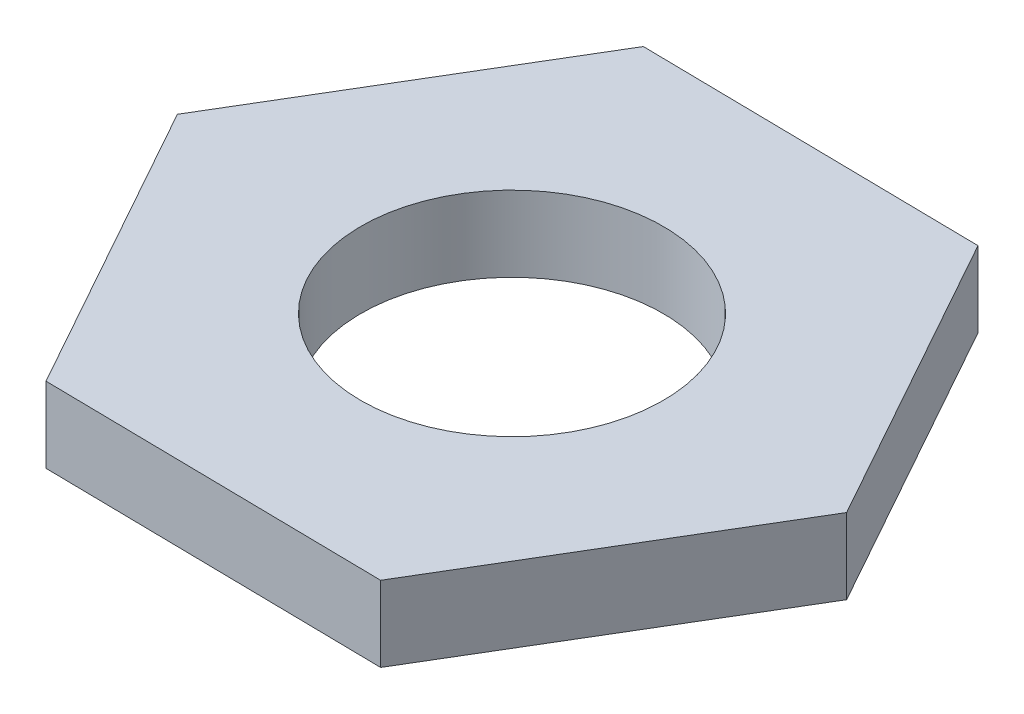
ISO-10303-21;
HEADER;
FILE_DESCRIPTION(('STEP AP214'),'2;1');
FILE_NAME('part.step','',(''),(''),'','','');
FILE_SCHEMA(('AUTOMOTIVE_DESIGN { 1 0 10303 214 1 1 1 1 }'));
ENDSEC;
DATA;
#1=APPLICATION_CONTEXT('core data for automotive mechanical design processes');
#2=APPLICATION_PROTOCOL_DEFINITION('international standard','automotive_design',2000,#1);
#3=PRODUCT_CONTEXT('',#1,'mechanical');
#4=PRODUCT('Part','Part','',(#3));
#5=PRODUCT_RELATED_PRODUCT_CATEGORY('part','',(#4));
#6=PRODUCT_DEFINITION_FORMATION('','',#4);
#7=PRODUCT_DEFINITION_CONTEXT('part definition',#1,'design');
#8=PRODUCT_DEFINITION('design','',#6,#7);
#9=PRODUCT_DEFINITION_SHAPE('','',#8);
#10=(LENGTH_UNIT() NAMED_UNIT(*) SI_UNIT(.MILLI.,.METRE.));
#11=(NAMED_UNIT(*) PLANE_ANGLE_UNIT() SI_UNIT($,.RADIAN.));
#12=(NAMED_UNIT(*) SI_UNIT($,.STERADIAN.) SOLID_ANGLE_UNIT());
#13=UNCERTAINTY_MEASURE_WITH_UNIT(LENGTH_MEASURE(1.E-05),#10,'distance_accuracy_value','');
#14=(GEOMETRIC_REPRESENTATION_CONTEXT(3) GLOBAL_UNCERTAINTY_ASSIGNED_CONTEXT((#13)) GLOBAL_UNIT_ASSIGNED_CONTEXT((#10,
#11,#12)) REPRESENTATION_CONTEXT('',''));
#15=CARTESIAN_POINT('',(0.,0.,0.));
#16=DIRECTION('',(0.,0.,1.));
#17=DIRECTION('',(1.,0.,0.));
#18=AXIS2_PLACEMENT_3D('',#15,#16,#17);
#19=CARTESIAN_POINT('',(0.,1.,0.));
#20=DIRECTION('',(0.,1.,0.));
#21=DIRECTION('',(0.,0.,1.));
#22=AXIS2_PLACEMENT_3D('',#19,#20,#21);
#23=PLANE('',#22);
#24=DIRECTION('',(0.513027599936732,0.,-0.858372111443025));
#25=VECTOR('',#24,1.);
#26=CARTESIAN_POINT('',(2.19086214498621,1.,3.93066445549177));
#27=LINE('',#26,#25);
#28=CARTESIAN_POINT('',(2.19086214498621,1.,3.93066445549177));
#29=VERTEX_POINT('',#28);
#30=CARTESIAN_POINT('',(4.4994863447015,1.,0.0679899539981618));
#31=VERTEX_POINT('',#30);
#32=EDGE_CURVE('E150',#29,#31,#27,.T.);
#33=ORIENTED_EDGE('',*,*,#32,.T.);
#34=DIRECTION('',(-0.48685825444138,0.,-0.873480990109282));
#35=VECTOR('',#34,1.);
#36=CARTESIAN_POINT('',(4.4994863447015,1.,0.0679899539981618));
#37=LINE('',#36,#35);
#38=CARTESIAN_POINT('',(2.30862419971529,1.,-3.86267450149361));
#39=VERTEX_POINT('',#38);
#40=EDGE_CURVE('E98',#31,#39,#37,.T.);
#41=ORIENTED_EDGE('',*,*,#40,.T.);
#42=DIRECTION('',(-0.999885854378113,0.,-0.0151088786662587));
#43=VECTOR('',#42,1.);
#44=CARTESIAN_POINT('',(2.30862419971529,1.,-3.86267450149361));
#45=LINE('',#44,#43);
#46=CARTESIAN_POINT('',(-2.19086214498621,1.,-3.93066445549177));
#47=VERTEX_POINT('',#46);
#48=EDGE_CURVE('E111',#39,#47,#45,.T.);
#49=ORIENTED_EDGE('',*,*,#48,.T.);
#50=DIRECTION('',(-0.513027599936733,0.,0.858372111443024));
#51=VECTOR('',#50,1.);
#52=CARTESIAN_POINT('',(-2.19086214498621,1.,-3.93066445549177));
#53=LINE('',#52,#51);
#54=CARTESIAN_POINT('',(-4.4994863447015,1.,-0.0679899539981613));
#55=VERTEX_POINT('',#54);
#56=EDGE_CURVE('E105',#47,#55,#53,.T.);
#57=ORIENTED_EDGE('',*,*,#56,.T.);
#58=DIRECTION('',(0.48685825444138,0.,0.873480990109283));
#59=VECTOR('',#58,1.);
#60=CARTESIAN_POINT('',(-4.4994863447015,1.,-0.0679899539981613));
#61=LINE('',#60,#59);
#62=CARTESIAN_POINT('',(-2.3086241997153,1.,3.86267450149361));
#63=VERTEX_POINT('',#62);
#64=EDGE_CURVE('E109',#55,#63,#61,.T.);
#65=ORIENTED_EDGE('',*,*,#64,.T.);
#66=DIRECTION('',(0.999885854378113,0.,0.0151088786662585));
#67=VECTOR('',#66,1.);
#68=CARTESIAN_POINT('',(-2.3086241997153,1.,3.86267450149361));
#69=LINE('',#68,#67);
#70=EDGE_CURVE('E61',#63,#29,#69,.T.);
#71=ORIENTED_EDGE('',*,*,#70,.T.);
#72=EDGE_LOOP('',(#33,#41,#49,#57,#65,#71));
#73=FACE_BOUND('',#72,.T.);
#74=CARTESIAN_POINT('',(0.,1.,0.));
#75=DIRECTION('',(0.,1.,0.));
#76=DIRECTION('',(0.,0.,1.));
#77=AXIS2_PLACEMENT_3D('',#74,#75,#76);
#78=CIRCLE('',#77,2.);
#79=CARTESIAN_POINT('',(0.,1.,2.));
#80=VERTEX_POINT('',#79);
#81=EDGE_CURVE('E138',#80,#80,#78,.T.);
#82=ORIENTED_EDGE('',*,*,#81,.F.);
#83=EDGE_LOOP('',(#82));
#84=FACE_BOUND('',#83,.T.);
#85=ADVANCED_FACE('F43',(#73,#84),#23,.T.);
#86=CARTESIAN_POINT('',(0.,0.,0.));
#87=DIRECTION('',(0.,1.,0.));
#88=DIRECTION('',(0.,0.,1.));
#89=AXIS2_PLACEMENT_3D('',#86,#87,#88);
#90=PLANE('',#89);
#91=DIRECTION('',(0.513027599936732,0.,-0.858372111443025));
#92=VECTOR('',#91,1.);
#93=CARTESIAN_POINT('',(2.19086214498621,0.,3.93066445549177));
#94=LINE('',#93,#92);
#95=CARTESIAN_POINT('',(2.19086214498621,0.,3.93066445549177));
#96=VERTEX_POINT('',#95);
#97=CARTESIAN_POINT('',(4.4994863447015,0.,0.0679899539981618));
#98=VERTEX_POINT('',#97);
#99=EDGE_CURVE('E133',#96,#98,#94,.T.);
#100=ORIENTED_EDGE('',*,*,#99,.F.);
#101=DIRECTION('',(0.999885854378113,0.,0.0151088786662585));
#102=VECTOR('',#101,1.);
#103=CARTESIAN_POINT('',(-2.3086241997153,0.,3.86267450149361));
#104=LINE('',#103,#102);
#105=CARTESIAN_POINT('',(-2.3086241997153,0.,3.86267450149361));
#106=VERTEX_POINT('',#105);
#107=EDGE_CURVE('E90',#106,#96,#104,.T.);
#108=ORIENTED_EDGE('',*,*,#107,.F.);
#109=DIRECTION('',(0.48685825444138,0.,0.873480990109283));
#110=VECTOR('',#109,1.);
#111=CARTESIAN_POINT('',(-4.4994863447015,0.,-0.0679899539981613));
#112=LINE('',#111,#110);
#113=CARTESIAN_POINT('',(-4.4994863447015,0.,-0.0679899539981613));
#114=VERTEX_POINT('',#113);
#115=EDGE_CURVE('E84',#114,#106,#112,.T.);
#116=ORIENTED_EDGE('',*,*,#115,.F.);
#117=DIRECTION('',(-0.513027599936733,0.,0.858372111443024));
#118=VECTOR('',#117,1.);
#119=CARTESIAN_POINT('',(-2.19086214498621,0.,-3.93066445549177));
#120=LINE('',#119,#118);
#121=CARTESIAN_POINT('',(-2.19086214498621,0.,-3.93066445549177));
#122=VERTEX_POINT('',#121);
#123=EDGE_CURVE('E120',#122,#114,#120,.T.);
#124=ORIENTED_EDGE('',*,*,#123,.F.);
#125=DIRECTION('',(-0.999885854378113,0.,-0.0151088786662587));
#126=VECTOR('',#125,1.);
#127=CARTESIAN_POINT('',(2.30862419971529,0.,-3.86267450149361));
#128=LINE('',#127,#126);
#129=CARTESIAN_POINT('',(2.30862419971529,0.,-3.86267450149361));
#130=VERTEX_POINT('',#129);
#131=EDGE_CURVE('E141',#130,#122,#128,.T.);
#132=ORIENTED_EDGE('',*,*,#131,.F.);
#133=DIRECTION('',(-0.48685825444138,0.,-0.873480990109282));
#134=VECTOR('',#133,1.);
#135=CARTESIAN_POINT('',(4.4994863447015,0.,0.0679899539981618));
#136=LINE('',#135,#134);
#137=EDGE_CURVE('E137',#98,#130,#136,.T.);
#138=ORIENTED_EDGE('',*,*,#137,.F.);
#139=EDGE_LOOP('',(#100,#108,#116,#124,#132,#138));
#140=FACE_BOUND('',#139,.T.);
#141=CARTESIAN_POINT('',(0.,0.,0.));
#142=DIRECTION('',(0.,1.,0.));
#143=DIRECTION('',(0.,0.,1.));
#144=AXIS2_PLACEMENT_3D('',#141,#142,#143);
#145=CIRCLE('',#144,2.);
#146=CARTESIAN_POINT('',(0.,0.,2.));
#147=VERTEX_POINT('',#146);
#148=EDGE_CURVE('E265',#147,#147,#145,.T.);
#149=ORIENTED_EDGE('',*,*,#148,.T.);
#150=EDGE_LOOP('',(#149));
#151=FACE_BOUND('',#150,.T.);
#152=ADVANCED_FACE('F163',(#140,#151),#90,.F.);
#153=CARTESIAN_POINT('',(2.19086214498621,1.,3.93066445549177));
#154=DIRECTION('',(-0.858372111443024,0.,-0.513027599936732));
#155=DIRECTION('',(-0.513027599936732,0.,0.858372111443024));
#156=AXIS2_PLACEMENT_3D('',#153,#154,#155);
#157=PLANE('',#156);
#158=ORIENTED_EDGE('',*,*,#99,.T.);
#159=DIRECTION('',(0.,-1.,0.));
#160=VECTOR('',#159,1.);
#161=CARTESIAN_POINT('',(4.4994863447015,1.,0.0679899539981618));
#162=LINE('',#161,#160);
#163=EDGE_CURVE('E11',#31,#98,#162,.T.);
#164=ORIENTED_EDGE('',*,*,#163,.F.);
#165=ORIENTED_EDGE('',*,*,#32,.F.);
#166=DIRECTION('',(0.,-1.,0.));
#167=VECTOR('',#166,1.);
#168=CARTESIAN_POINT('',(2.19086214498621,1.,3.93066445549177));
#169=LINE('',#168,#167);
#170=EDGE_CURVE('E129',#29,#96,#169,.T.);
#171=ORIENTED_EDGE('',*,*,#170,.T.);
#172=EDGE_LOOP('',(#158,#164,#165,#171));
#173=FACE_BOUND('',#172,.T.);
#174=ADVANCED_FACE('F45',(#173),#157,.F.);
#175=CARTESIAN_POINT('',(4.4994863447015,1.,0.0679899539981618));
#176=DIRECTION('',(-0.873480990109282,0.,0.48685825444138));
#177=DIRECTION('',(0.48685825444138,0.,0.873480990109282));
#178=AXIS2_PLACEMENT_3D('',#175,#176,#177);
#179=PLANE('',#178);
#180=ORIENTED_EDGE('',*,*,#137,.T.);
#181=DIRECTION('',(0.,-1.,0.));
#182=VECTOR('',#181,1.);
#183=CARTESIAN_POINT('',(2.30862419971529,1.,-3.86267450149361));
#184=LINE('',#183,#182);
#185=EDGE_CURVE('E53',#39,#130,#184,.T.);
#186=ORIENTED_EDGE('',*,*,#185,.F.);
#187=ORIENTED_EDGE('',*,*,#40,.F.);
#188=ORIENTED_EDGE('',*,*,#163,.T.);
#189=EDGE_LOOP('',(#180,#186,#187,#188));
#190=FACE_BOUND('',#189,.T.);
#191=ADVANCED_FACE('F188',(#190),#179,.F.);
#192=CARTESIAN_POINT('',(2.30862419971529,1.,-3.86267450149361));
#193=DIRECTION('',(-0.0151088786662587,0.,0.999885854378113));
#194=DIRECTION('',(0.999885854378113,0.,0.0151088786662587));
#195=AXIS2_PLACEMENT_3D('',#192,#193,#194);
#196=PLANE('',#195);
#197=ORIENTED_EDGE('',*,*,#131,.T.);
#198=DIRECTION('',(0.,-1.,0.));
#199=VECTOR('',#198,1.);
#200=CARTESIAN_POINT('',(-2.19086214498621,1.,-3.93066445549177));
#201=LINE('',#200,#199);
#202=EDGE_CURVE('E122',#47,#122,#201,.T.);
#203=ORIENTED_EDGE('',*,*,#202,.F.);
#204=ORIENTED_EDGE('',*,*,#48,.F.);
#205=ORIENTED_EDGE('',*,*,#185,.T.);
#206=EDGE_LOOP('',(#197,#203,#204,#205));
#207=FACE_BOUND('',#206,.T.);
#208=ADVANCED_FACE('F160',(#207),#196,.F.);
#209=CARTESIAN_POINT('',(-2.19086214498621,1.,-3.93066445549177));
#210=DIRECTION('',(0.858372111443024,0.,0.513027599936733));
#211=DIRECTION('',(0.513027599936733,0.,-0.858372111443024));
#212=AXIS2_PLACEMENT_3D('',#209,#210,#211);
#213=PLANE('',#212);
#214=ORIENTED_EDGE('',*,*,#123,.T.);
#215=DIRECTION('',(0.,-1.,0.));
#216=VECTOR('',#215,1.);
#217=CARTESIAN_POINT('',(-4.4994863447015,1.,-0.0679899539981613));
#218=LINE('',#217,#216);
#219=EDGE_CURVE('E117',#55,#114,#218,.T.);
#220=ORIENTED_EDGE('',*,*,#219,.F.);
#221=ORIENTED_EDGE('',*,*,#56,.F.);
#222=ORIENTED_EDGE('',*,*,#202,.T.);
#223=EDGE_LOOP('',(#214,#220,#221,#222));
#224=FACE_BOUND('',#223,.T.);
#225=ADVANCED_FACE('F118',(#224),#213,.F.);
#226=CARTESIAN_POINT('',(-4.4994863447015,1.,-0.0679899539981613));
#227=DIRECTION('',(0.873480990109283,0.,-0.48685825444138));
#228=DIRECTION('',(-0.48685825444138,0.,-0.873480990109283));
#229=AXIS2_PLACEMENT_3D('',#226,#227,#228);
#230=PLANE('',#229);
#231=ORIENTED_EDGE('',*,*,#115,.T.);
#232=DIRECTION('',(0.,-1.,0.));
#233=VECTOR('',#232,1.);
#234=CARTESIAN_POINT('',(-2.3086241997153,1.,3.86267450149361));
#235=LINE('',#234,#233);
#236=EDGE_CURVE('E123',#63,#106,#235,.T.);
#237=ORIENTED_EDGE('',*,*,#236,.F.);
#238=ORIENTED_EDGE('',*,*,#64,.F.);
#239=ORIENTED_EDGE('',*,*,#219,.T.);
#240=EDGE_LOOP('',(#231,#237,#238,#239));
#241=FACE_BOUND('',#240,.T.);
#242=ADVANCED_FACE('F125',(#241),#230,.F.);
#243=CARTESIAN_POINT('',(-2.3086241997153,1.,3.86267450149361));
#244=DIRECTION('',(0.0151088786662585,0.,-0.999885854378113));
#245=DIRECTION('',(-0.999885854378113,0.,-0.0151088786662585));
#246=AXIS2_PLACEMENT_3D('',#243,#244,#245);
#247=PLANE('',#246);
#248=ORIENTED_EDGE('',*,*,#107,.T.);
#249=ORIENTED_EDGE('',*,*,#170,.F.);
#250=ORIENTED_EDGE('',*,*,#70,.F.);
#251=ORIENTED_EDGE('',*,*,#236,.T.);
#252=EDGE_LOOP('',(#248,#249,#250,#251));
#253=FACE_BOUND('',#252,.T.);
#254=ADVANCED_FACE('F168',(#253),#247,.F.);
#255=CARTESIAN_POINT('',(0.,1.,0.));
#256=DIRECTION('',(0.,-1.,0.));
#257=DIRECTION('',(0.,0.,-1.));
#258=AXIS2_PLACEMENT_3D('',#255,#256,#257);
#259=CYLINDRICAL_SURFACE('',#258,2.);
#260=ORIENTED_EDGE('',*,*,#81,.T.);
#261=EDGE_LOOP('',(#260));
#262=FACE_BOUND('',#261,.T.);
#263=ORIENTED_EDGE('',*,*,#148,.F.);
#264=EDGE_LOOP('',(#263));
#265=FACE_BOUND('',#264,.T.);
#266=ADVANCED_FACE('F170',(#262,#265),#259,.F.);
#267=CLOSED_SHELL('',(#85,#152,#174,#191,#208,#225,#242,#254,#266));
#268=MANIFOLD_SOLID_BREP('B2',#267);
#269=ADVANCED_BREP_SHAPE_REPRESENTATION('',(#18,#268),#14);
#270=SHAPE_DEFINITION_REPRESENTATION(#9,#269);
ENDSEC;
END-ISO-10303-21;
